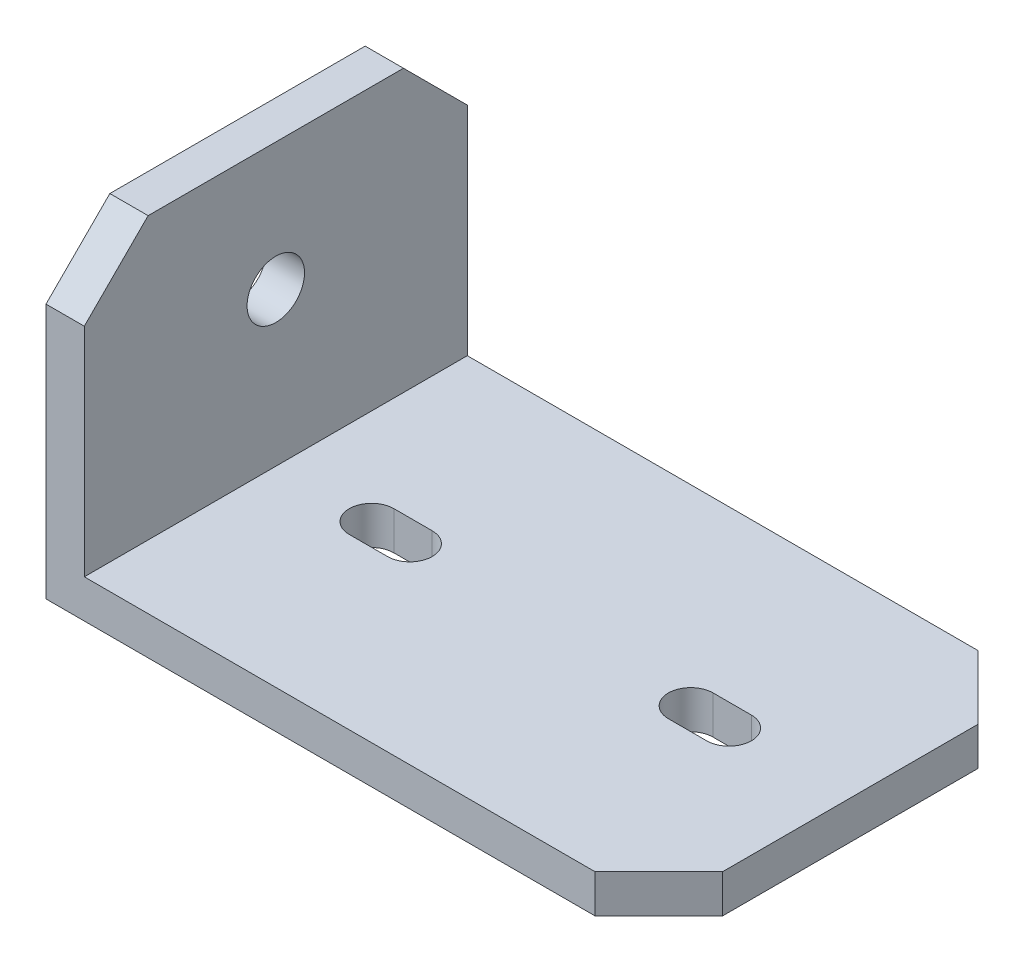
ISO-10303-21;
HEADER;
FILE_DESCRIPTION(('STEP AP214'),'2;1');
FILE_NAME('part.step','',(''),(''),'','','');
FILE_SCHEMA(('AUTOMOTIVE_DESIGN { 1 0 10303 214 1 1 1 1 }'));
ENDSEC;
DATA;
#1=APPLICATION_CONTEXT('core data for automotive mechanical design processes');
#2=APPLICATION_PROTOCOL_DEFINITION('international standard','automotive_design',2000,#1);
#3=PRODUCT_CONTEXT('',#1,'mechanical');
#4=PRODUCT('Part','Part','',(#3));
#5=PRODUCT_RELATED_PRODUCT_CATEGORY('part','',(#4));
#6=PRODUCT_DEFINITION_FORMATION('','',#4);
#7=PRODUCT_DEFINITION_CONTEXT('part definition',#1,'design');
#8=PRODUCT_DEFINITION('design','',#6,#7);
#9=PRODUCT_DEFINITION_SHAPE('','',#8);
#10=(LENGTH_UNIT() NAMED_UNIT(*) SI_UNIT(.MILLI.,.METRE.));
#11=(NAMED_UNIT(*) PLANE_ANGLE_UNIT() SI_UNIT($,.RADIAN.));
#12=(NAMED_UNIT(*) SI_UNIT($,.STERADIAN.) SOLID_ANGLE_UNIT());
#13=UNCERTAINTY_MEASURE_WITH_UNIT(LENGTH_MEASURE(1.E-05),#10,'distance_accuracy_value','');
#14=(GEOMETRIC_REPRESENTATION_CONTEXT(3) GLOBAL_UNCERTAINTY_ASSIGNED_CONTEXT((#13)) GLOBAL_UNIT_ASSIGNED_CONTEXT((#10,
#11,#12)) REPRESENTATION_CONTEXT('',''));
#15=CARTESIAN_POINT('',(0.,0.,0.));
#16=DIRECTION('',(0.,0.,1.));
#17=DIRECTION('',(1.,0.,0.));
#18=AXIS2_PLACEMENT_3D('',#15,#16,#17);
#19=CARTESIAN_POINT('',(-3.,22.,30.));
#20=DIRECTION('',(0.,-1.,0.));
#21=DIRECTION('',(0.,0.,-1.));
#22=AXIS2_PLACEMENT_3D('',#19,#20,#21);
#23=PLANE('',#22);
#24=DIRECTION('',(0.,0.,-1.));
#25=VECTOR('',#24,1.);
#26=CARTESIAN_POINT('',(-3.,22.,30.));
#27=LINE('',#26,#25);
#28=CARTESIAN_POINT('',(-3.,22.,25.));
#29=VERTEX_POINT('',#28);
#30=CARTESIAN_POINT('',(-3.,22.,5.));
#31=VERTEX_POINT('',#30);
#32=EDGE_CURVE('E273',#29,#31,#27,.T.);
#33=ORIENTED_EDGE('',*,*,#32,.F.);
#34=DIRECTION('',(1.,0.,0.));
#35=VECTOR('',#34,1.);
#36=CARTESIAN_POINT('',(-3.,22.,25.));
#37=LINE('',#36,#35);
#38=CARTESIAN_POINT('',(0.,22.,25.));
#39=VERTEX_POINT('',#38);
#40=EDGE_CURVE('E289',#29,#39,#37,.T.);
#41=ORIENTED_EDGE('',*,*,#40,.T.);
#42=DIRECTION('',(0.,0.,-1.));
#43=VECTOR('',#42,1.);
#44=CARTESIAN_POINT('',(0.,22.,30.));
#45=LINE('',#44,#43);
#46=CARTESIAN_POINT('',(0.,22.,5.));
#47=VERTEX_POINT('',#46);
#48=EDGE_CURVE('E252',#39,#47,#45,.T.);
#49=ORIENTED_EDGE('',*,*,#48,.T.);
#50=DIRECTION('',(-1.,0.,0.));
#51=VECTOR('',#50,1.);
#52=CARTESIAN_POINT('',(-3.,22.,5.));
#53=LINE('',#52,#51);
#54=EDGE_CURVE('E286',#47,#31,#53,.T.);
#55=ORIENTED_EDGE('',*,*,#54,.T.);
#56=EDGE_LOOP('',(#33,#41,#49,#55));
#57=FACE_BOUND('',#56,.T.);
#58=ADVANCED_FACE('F33',(#57),#23,.F.);
#59=CARTESIAN_POINT('',(-3.,-3.,30.));
#60=DIRECTION('',(1.,0.,0.));
#61=DIRECTION('',(0.,0.,-1.));
#62=AXIS2_PLACEMENT_3D('',#59,#60,#61);
#63=PLANE('',#62);
#64=CARTESIAN_POINT('',(-3.,12.,15.));
#65=DIRECTION('',(1.,0.,0.));
#66=DIRECTION('',(0.,0.,-1.));
#67=AXIS2_PLACEMENT_3D('',#64,#65,#66);
#68=CIRCLE('',#67,2.25);
#69=CARTESIAN_POINT('',(-3.,12.,12.75));
#70=VERTEX_POINT('',#69);
#71=EDGE_CURVE('E237',#70,#70,#68,.T.);
#72=ORIENTED_EDGE('',*,*,#71,.T.);
#73=EDGE_LOOP('',(#72));
#74=FACE_BOUND('',#73,.T.);
#75=DIRECTION('',(0.,-1.,0.));
#76=VECTOR('',#75,1.);
#77=CARTESIAN_POINT('',(-3.,-3.,30.));
#78=LINE('',#77,#76);
#79=CARTESIAN_POINT('',(-3.,17.,30.));
#80=VERTEX_POINT('',#79);
#81=CARTESIAN_POINT('',(-3.,-3.,30.));
#82=VERTEX_POINT('',#81);
#83=EDGE_CURVE('E241',#80,#82,#78,.T.);
#84=ORIENTED_EDGE('',*,*,#83,.F.);
#85=DIRECTION('',(0.,-0.707106781186546,0.707106781186549));
#86=VECTOR('',#85,1.);
#87=CARTESIAN_POINT('',(-3.,17.,30.));
#88=LINE('',#87,#86);
#89=EDGE_CURVE('E284',#80,#29,#88,.F.);
#90=ORIENTED_EDGE('',*,*,#89,.T.);
#91=ORIENTED_EDGE('',*,*,#32,.T.);
#92=DIRECTION('',(0.,-0.707106781186549,-0.707106781186546));
#93=VECTOR('',#92,1.);
#94=CARTESIAN_POINT('',(-3.,22.,5.));
#95=LINE('',#94,#93);
#96=CARTESIAN_POINT('',(-3.,17.,0.));
#97=VERTEX_POINT('',#96);
#98=EDGE_CURVE('E282',#31,#97,#95,.T.);
#99=ORIENTED_EDGE('',*,*,#98,.T.);
#100=DIRECTION('',(0.,-1.,0.));
#101=VECTOR('',#100,1.);
#102=CARTESIAN_POINT('',(-3.,-3.,0.));
#103=LINE('',#102,#101);
#104=CARTESIAN_POINT('',(-3.,-3.,0.));
#105=VERTEX_POINT('',#104);
#106=EDGE_CURVE('E240',#97,#105,#103,.T.);
#107=ORIENTED_EDGE('',*,*,#106,.T.);
#108=DIRECTION('',(0.,0.,-1.));
#109=VECTOR('',#108,1.);
#110=CARTESIAN_POINT('',(-3.,-3.,30.));
#111=LINE('',#110,#109);
#112=EDGE_CURVE('E270',#82,#105,#111,.T.);
#113=ORIENTED_EDGE('',*,*,#112,.F.);
#114=EDGE_LOOP('',(#84,#90,#91,#99,#107,#113));
#115=FACE_BOUND('',#114,.T.);
#116=ADVANCED_FACE('F337',(#74,#115),#63,.F.);
#117=CARTESIAN_POINT('',(45.,-3.,30.));
#118=DIRECTION('',(0.,1.,0.));
#119=DIRECTION('',(-1.,0.,0.));
#120=AXIS2_PLACEMENT_3D('',#117,#118,#119);
#121=PLANE('',#120);
#122=DIRECTION('',(-1.,0.,0.));
#123=VECTOR('',#122,1.);
#124=CARTESIAN_POINT('',(45.,-3.,13.25));
#125=LINE('',#124,#123);
#126=CARTESIAN_POINT('',(35.5,-3.,13.25));
#127=VERTEX_POINT('',#126);
#128=CARTESIAN_POINT('',(32.5,-3.,13.25));
#129=VERTEX_POINT('',#128);
#130=EDGE_CURVE('E196',#127,#129,#125,.T.);
#131=ORIENTED_EDGE('',*,*,#130,.T.);
#132=CARTESIAN_POINT('',(32.5,-3.,15.));
#133=DIRECTION('',(0.,1.,0.));
#134=DIRECTION('',(-1.,0.,0.));
#135=AXIS2_PLACEMENT_3D('',#132,#133,#134);
#136=CIRCLE('',#135,1.75);
#137=CARTESIAN_POINT('',(32.5,-3.,16.75));
#138=VERTEX_POINT('',#137);
#139=EDGE_CURVE('E199',#129,#138,#136,.T.);
#140=ORIENTED_EDGE('',*,*,#139,.T.);
#141=DIRECTION('',(1.,0.,0.));
#142=VECTOR('',#141,1.);
#143=CARTESIAN_POINT('',(45.,-3.,16.75));
#144=LINE('',#143,#142);
#145=CARTESIAN_POINT('',(35.5,-3.,16.75));
#146=VERTEX_POINT('',#145);
#147=EDGE_CURVE('E191',#138,#146,#144,.T.);
#148=ORIENTED_EDGE('',*,*,#147,.T.);
#149=CARTESIAN_POINT('',(35.5,-3.,15.));
#150=DIRECTION('',(0.,1.,0.));
#151=DIRECTION('',(-1.,0.,0.));
#152=AXIS2_PLACEMENT_3D('',#149,#150,#151);
#153=CIRCLE('',#152,1.75);
#154=EDGE_CURVE('E166',#146,#127,#153,.T.);
#155=ORIENTED_EDGE('',*,*,#154,.T.);
#156=EDGE_LOOP('',(#131,#140,#148,#155));
#157=FACE_BOUND('',#156,.T.);
#158=DIRECTION('',(-1.,0.,0.));
#159=VECTOR('',#158,1.);
#160=CARTESIAN_POINT('',(45.,-3.,13.25));
#161=LINE('',#160,#159);
#162=CARTESIAN_POINT('',(10.5,-3.,13.25));
#163=VERTEX_POINT('',#162);
#164=CARTESIAN_POINT('',(7.5,-3.,13.25));
#165=VERTEX_POINT('',#164);
#166=EDGE_CURVE('E228',#163,#165,#161,.T.);
#167=ORIENTED_EDGE('',*,*,#166,.T.);
#168=CARTESIAN_POINT('',(7.5,-3.,15.));
#169=DIRECTION('',(0.,1.,0.));
#170=DIRECTION('',(-1.,0.,0.));
#171=AXIS2_PLACEMENT_3D('',#168,#169,#170);
#172=CIRCLE('',#171,1.75);
#173=CARTESIAN_POINT('',(7.5,-3.,16.75));
#174=VERTEX_POINT('',#173);
#175=EDGE_CURVE('E231',#165,#174,#172,.T.);
#176=ORIENTED_EDGE('',*,*,#175,.T.);
#177=DIRECTION('',(1.,0.,0.));
#178=VECTOR('',#177,1.);
#179=CARTESIAN_POINT('',(45.,-3.,16.75));
#180=LINE('',#179,#178);
#181=CARTESIAN_POINT('',(10.5,-3.,16.75));
#182=VERTEX_POINT('',#181);
#183=EDGE_CURVE('E216',#174,#182,#180,.T.);
#184=ORIENTED_EDGE('',*,*,#183,.T.);
#185=CARTESIAN_POINT('',(10.5,-3.,15.));
#186=DIRECTION('',(0.,1.,0.));
#187=DIRECTION('',(-1.,0.,0.));
#188=AXIS2_PLACEMENT_3D('',#185,#186,#187);
#189=CIRCLE('',#188,1.75);
#190=EDGE_CURVE('E225',#182,#163,#189,.T.);
#191=ORIENTED_EDGE('',*,*,#190,.T.);
#192=EDGE_LOOP('',(#167,#176,#184,#191));
#193=FACE_BOUND('',#192,.T.);
#194=DIRECTION('',(0.,0.,-1.));
#195=VECTOR('',#194,1.);
#196=CARTESIAN_POINT('',(45.,-3.,30.));
#197=LINE('',#196,#195);
#198=CARTESIAN_POINT('',(45.,-3.,25.));
#199=VERTEX_POINT('',#198);
#200=CARTESIAN_POINT('',(45.,-3.,5.));
#201=VERTEX_POINT('',#200);
#202=EDGE_CURVE('E268',#199,#201,#197,.T.);
#203=ORIENTED_EDGE('',*,*,#202,.F.);
#204=DIRECTION('',(0.707106781186545,0.,-0.70710678118655));
#205=VECTOR('',#204,1.);
#206=CARTESIAN_POINT('',(40.,-3.,30.));
#207=LINE('',#206,#205);
#208=CARTESIAN_POINT('',(40.,-3.,30.));
#209=VERTEX_POINT('',#208);
#210=EDGE_CURVE('E11',#199,#209,#207,.F.);
#211=ORIENTED_EDGE('',*,*,#210,.T.);
#212=DIRECTION('',(1.,0.,0.));
#213=VECTOR('',#212,1.);
#214=CARTESIAN_POINT('',(45.,-3.,30.));
#215=LINE('',#214,#213);
#216=EDGE_CURVE('E243',#82,#209,#215,.T.);
#217=ORIENTED_EDGE('',*,*,#216,.F.);
#218=ORIENTED_EDGE('',*,*,#112,.T.);
#219=DIRECTION('',(1.,0.,0.));
#220=VECTOR('',#219,1.);
#221=CARTESIAN_POINT('',(45.,-3.,0.));
#222=LINE('',#221,#220);
#223=CARTESIAN_POINT('',(40.,-3.,0.));
#224=VERTEX_POINT('',#223);
#225=EDGE_CURVE('E254',#105,#224,#222,.T.);
#226=ORIENTED_EDGE('',*,*,#225,.T.);
#227=DIRECTION('',(0.707106781186549,0.,0.707106781186546));
#228=VECTOR('',#227,1.);
#229=CARTESIAN_POINT('',(45.,-3.,5.));
#230=LINE('',#229,#228);
#231=EDGE_CURVE('E41',#224,#201,#230,.T.);
#232=ORIENTED_EDGE('',*,*,#231,.T.);
#233=EDGE_LOOP('',(#203,#211,#217,#218,#226,#232));
#234=FACE_BOUND('',#233,.T.);
#235=ADVANCED_FACE('F322',(#157,#193,#234),#121,.F.);
#236=CARTESIAN_POINT('',(45.,0.,30.));
#237=DIRECTION('',(-1.,0.,0.));
#238=DIRECTION('',(0.,0.,1.));
#239=AXIS2_PLACEMENT_3D('',#236,#237,#238);
#240=PLANE('',#239);
#241=DIRECTION('',(0.,0.,-1.));
#242=VECTOR('',#241,1.);
#243=CARTESIAN_POINT('',(45.,0.,30.));
#244=LINE('',#243,#242);
#245=CARTESIAN_POINT('',(45.,0.,25.));
#246=VERTEX_POINT('',#245);
#247=CARTESIAN_POINT('',(45.,0.,5.));
#248=VERTEX_POINT('',#247);
#249=EDGE_CURVE('E265',#246,#248,#244,.T.);
#250=ORIENTED_EDGE('',*,*,#249,.F.);
#251=DIRECTION('',(0.,-1.,0.));
#252=VECTOR('',#251,1.);
#253=CARTESIAN_POINT('',(45.,0.,25.));
#254=LINE('',#253,#252);
#255=EDGE_CURVE('E54',#246,#199,#254,.T.);
#256=ORIENTED_EDGE('',*,*,#255,.T.);
#257=ORIENTED_EDGE('',*,*,#202,.T.);
#258=DIRECTION('',(0.,1.,0.));
#259=VECTOR('',#258,1.);
#260=CARTESIAN_POINT('',(45.,0.,5.));
#261=LINE('',#260,#259);
#262=EDGE_CURVE('E303',#201,#248,#261,.T.);
#263=ORIENTED_EDGE('',*,*,#262,.T.);
#264=EDGE_LOOP('',(#250,#256,#257,#263));
#265=FACE_BOUND('',#264,.T.);
#266=ADVANCED_FACE('F307',(#265),#240,.F.);
#267=CARTESIAN_POINT('',(0.,0.,30.));
#268=DIRECTION('',(0.,-1.,0.));
#269=DIRECTION('',(0.,0.,-1.));
#270=AXIS2_PLACEMENT_3D('',#267,#268,#269);
#271=PLANE('',#270);
#272=DIRECTION('',(1.,0.,0.));
#273=VECTOR('',#272,1.);
#274=CARTESIAN_POINT('',(32.5,0.,16.75));
#275=LINE('',#274,#273);
#276=CARTESIAN_POINT('',(32.5,0.,16.75));
#277=VERTEX_POINT('',#276);
#278=CARTESIAN_POINT('',(35.5,0.,16.75));
#279=VERTEX_POINT('',#278);
#280=EDGE_CURVE('E174',#277,#279,#275,.T.);
#281=ORIENTED_EDGE('',*,*,#280,.F.);
#282=CARTESIAN_POINT('',(32.5,0.,15.));
#283=DIRECTION('',(0.,1.,0.));
#284=DIRECTION('',(0.,0.,1.));
#285=AXIS2_PLACEMENT_3D('',#282,#283,#284);
#286=CIRCLE('',#285,1.75);
#287=CARTESIAN_POINT('',(32.5,0.,13.25));
#288=VERTEX_POINT('',#287);
#289=EDGE_CURVE('E179',#288,#277,#286,.T.);
#290=ORIENTED_EDGE('',*,*,#289,.F.);
#291=DIRECTION('',(-1.,0.,0.));
#292=VECTOR('',#291,1.);
#293=CARTESIAN_POINT('',(32.5,0.,13.25));
#294=LINE('',#293,#292);
#295=CARTESIAN_POINT('',(35.5,0.,13.25));
#296=VERTEX_POINT('',#295);
#297=EDGE_CURVE('E184',#296,#288,#294,.T.);
#298=ORIENTED_EDGE('',*,*,#297,.F.);
#299=CARTESIAN_POINT('',(35.5,0.,15.));
#300=DIRECTION('',(0.,1.,0.));
#301=DIRECTION('',(0.,0.,1.));
#302=AXIS2_PLACEMENT_3D('',#299,#300,#301);
#303=CIRCLE('',#302,1.75);
#304=EDGE_CURVE('E163',#279,#296,#303,.T.);
#305=ORIENTED_EDGE('',*,*,#304,.F.);
#306=EDGE_LOOP('',(#281,#290,#298,#305));
#307=FACE_BOUND('',#306,.T.);
#308=DIRECTION('',(1.,0.,0.));
#309=VECTOR('',#308,1.);
#310=CARTESIAN_POINT('',(7.5,0.,16.75));
#311=LINE('',#310,#309);
#312=CARTESIAN_POINT('',(7.5,0.,16.75));
#313=VERTEX_POINT('',#312);
#314=CARTESIAN_POINT('',(10.5,0.,16.75));
#315=VERTEX_POINT('',#314);
#316=EDGE_CURVE('E204',#313,#315,#311,.T.);
#317=ORIENTED_EDGE('',*,*,#316,.F.);
#318=CARTESIAN_POINT('',(7.5,0.,15.));
#319=DIRECTION('',(0.,1.,0.));
#320=DIRECTION('',(0.,0.,1.));
#321=AXIS2_PLACEMENT_3D('',#318,#319,#320);
#322=CIRCLE('',#321,1.75);
#323=CARTESIAN_POINT('',(7.5,0.,13.25));
#324=VERTEX_POINT('',#323);
#325=EDGE_CURVE('E202',#324,#313,#322,.T.);
#326=ORIENTED_EDGE('',*,*,#325,.F.);
#327=DIRECTION('',(-1.,0.,0.));
#328=VECTOR('',#327,1.);
#329=CARTESIAN_POINT('',(7.5,0.,13.25));
#330=LINE('',#329,#328);
#331=CARTESIAN_POINT('',(10.5,0.,13.25));
#332=VERTEX_POINT('',#331);
#333=EDGE_CURVE('E210',#332,#324,#330,.T.);
#334=ORIENTED_EDGE('',*,*,#333,.F.);
#335=CARTESIAN_POINT('',(10.5,0.,15.));
#336=DIRECTION('',(0.,1.,0.));
#337=DIRECTION('',(0.,0.,1.));
#338=AXIS2_PLACEMENT_3D('',#335,#336,#337);
#339=CIRCLE('',#338,1.75);
#340=EDGE_CURVE('E207',#315,#332,#339,.T.);
#341=ORIENTED_EDGE('',*,*,#340,.F.);
#342=EDGE_LOOP('',(#317,#326,#334,#341));
#343=FACE_BOUND('',#342,.T.);
#344=DIRECTION('',(-1.,0.,0.));
#345=VECTOR('',#344,1.);
#346=CARTESIAN_POINT('',(0.,0.,30.));
#347=LINE('',#346,#345);
#348=CARTESIAN_POINT('',(40.,0.,30.));
#349=VERTEX_POINT('',#348);
#350=CARTESIAN_POINT('',(0.,0.,30.));
#351=VERTEX_POINT('',#350);
#352=EDGE_CURVE('E247',#349,#351,#347,.T.);
#353=ORIENTED_EDGE('',*,*,#352,.F.);
#354=DIRECTION('',(-0.707106781186545,0.,0.70710678118655));
#355=VECTOR('',#354,1.);
#356=CARTESIAN_POINT('',(40.,0.,30.));
#357=LINE('',#356,#355);
#358=EDGE_CURVE('E301',#349,#246,#357,.F.);
#359=ORIENTED_EDGE('',*,*,#358,.T.);
#360=ORIENTED_EDGE('',*,*,#249,.T.);
#361=DIRECTION('',(-0.707106781186549,0.,-0.707106781186546));
#362=VECTOR('',#361,1.);
#363=CARTESIAN_POINT('',(45.,0.,5.));
#364=LINE('',#363,#362);
#365=CARTESIAN_POINT('',(40.,0.,0.));
#366=VERTEX_POINT('',#365);
#367=EDGE_CURVE('E299',#248,#366,#364,.T.);
#368=ORIENTED_EDGE('',*,*,#367,.T.);
#369=DIRECTION('',(-1.,0.,0.));
#370=VECTOR('',#369,1.);
#371=CARTESIAN_POINT('',(0.,0.,0.));
#372=LINE('',#371,#370);
#373=CARTESIAN_POINT('',(0.,0.,0.));
#374=VERTEX_POINT('',#373);
#375=EDGE_CURVE('E256',#366,#374,#372,.T.);
#376=ORIENTED_EDGE('',*,*,#375,.T.);
#377=DIRECTION('',(0.,0.,-1.));
#378=VECTOR('',#377,1.);
#379=CARTESIAN_POINT('',(0.,0.,30.));
#380=LINE('',#379,#378);
#381=EDGE_CURVE('E262',#351,#374,#380,.T.);
#382=ORIENTED_EDGE('',*,*,#381,.F.);
#383=EDGE_LOOP('',(#353,#359,#360,#368,#376,#382));
#384=FACE_BOUND('',#383,.T.);
#385=ADVANCED_FACE('F181',(#307,#343,#384),#271,.F.);
#386=CARTESIAN_POINT('',(0.,22.,30.));
#387=DIRECTION('',(-1.,0.,0.));
#388=DIRECTION('',(0.,-1.,0.));
#389=AXIS2_PLACEMENT_3D('',#386,#387,#388);
#390=PLANE('',#389);
#391=CARTESIAN_POINT('',(0.,12.,15.));
#392=DIRECTION('',(1.,0.,0.));
#393=DIRECTION('',(0.,1.,0.));
#394=AXIS2_PLACEMENT_3D('',#391,#392,#393);
#395=CIRCLE('',#394,2.25);
#396=CARTESIAN_POINT('',(0.,14.25,15.));
#397=VERTEX_POINT('',#396);
#398=EDGE_CURVE('E234',#397,#397,#395,.T.);
#399=ORIENTED_EDGE('',*,*,#398,.F.);
#400=EDGE_LOOP('',(#399));
#401=FACE_BOUND('',#400,.T.);
#402=ORIENTED_EDGE('',*,*,#48,.F.);
#403=DIRECTION('',(0.,0.707106781186546,-0.707106781186549));
#404=VECTOR('',#403,1.);
#405=CARTESIAN_POINT('',(0.,17.,30.));
#406=LINE('',#405,#404);
#407=CARTESIAN_POINT('',(0.,17.,30.));
#408=VERTEX_POINT('',#407);
#409=EDGE_CURVE('E293',#39,#408,#406,.F.);
#410=ORIENTED_EDGE('',*,*,#409,.T.);
#411=DIRECTION('',(0.,1.,0.));
#412=VECTOR('',#411,1.);
#413=CARTESIAN_POINT('',(0.,22.,30.));
#414=LINE('',#413,#412);
#415=EDGE_CURVE('E249',#351,#408,#414,.T.);
#416=ORIENTED_EDGE('',*,*,#415,.F.);
#417=ORIENTED_EDGE('',*,*,#381,.T.);
#418=DIRECTION('',(0.,1.,0.));
#419=VECTOR('',#418,1.);
#420=CARTESIAN_POINT('',(0.,22.,0.));
#421=LINE('',#420,#419);
#422=CARTESIAN_POINT('',(0.,17.,0.));
#423=VERTEX_POINT('',#422);
#424=EDGE_CURVE('E244',#374,#423,#421,.T.);
#425=ORIENTED_EDGE('',*,*,#424,.T.);
#426=DIRECTION('',(0.,0.707106781186549,0.707106781186546));
#427=VECTOR('',#426,1.);
#428=CARTESIAN_POINT('',(0.,22.,5.));
#429=LINE('',#428,#427);
#430=EDGE_CURVE('E291',#423,#47,#429,.T.);
#431=ORIENTED_EDGE('',*,*,#430,.T.);
#432=EDGE_LOOP('',(#402,#410,#416,#417,#425,#431));
#433=FACE_BOUND('',#432,.T.);
#434=ADVANCED_FACE('F360',(#401,#433),#390,.F.);
#435=CARTESIAN_POINT('',(0.,0.,30.));
#436=DIRECTION('',(0.,0.,-1.));
#437=DIRECTION('',(-1.,0.,0.));
#438=AXIS2_PLACEMENT_3D('',#435,#436,#437);
#439=PLANE('',#438);
#440=ORIENTED_EDGE('',*,*,#415,.T.);
#441=DIRECTION('',(-1.,0.,0.));
#442=VECTOR('',#441,1.);
#443=CARTESIAN_POINT('',(0.,17.,30.));
#444=LINE('',#443,#442);
#445=EDGE_CURVE('E279',#408,#80,#444,.T.);
#446=ORIENTED_EDGE('',*,*,#445,.T.);
#447=ORIENTED_EDGE('',*,*,#83,.T.);
#448=ORIENTED_EDGE('',*,*,#216,.T.);
#449=DIRECTION('',(0.,1.,0.));
#450=VECTOR('',#449,1.);
#451=CARTESIAN_POINT('',(40.,0.,30.));
#452=LINE('',#451,#450);
#453=EDGE_CURVE('E276',#209,#349,#452,.T.);
#454=ORIENTED_EDGE('',*,*,#453,.T.);
#455=ORIENTED_EDGE('',*,*,#352,.T.);
#456=EDGE_LOOP('',(#440,#446,#447,#448,#454,#455));
#457=FACE_BOUND('',#456,.T.);
#458=ADVANCED_FACE('F318',(#457),#439,.F.);
#459=CARTESIAN_POINT('',(0.,0.,0.));
#460=DIRECTION('',(0.,0.,-1.));
#461=DIRECTION('',(-1.,0.,0.));
#462=AXIS2_PLACEMENT_3D('',#459,#460,#461);
#463=PLANE('',#462);
#464=ORIENTED_EDGE('',*,*,#106,.F.);
#465=DIRECTION('',(1.,0.,0.));
#466=VECTOR('',#465,1.);
#467=CARTESIAN_POINT('',(0.,17.,0.));
#468=LINE('',#467,#466);
#469=EDGE_CURVE('E297',#97,#423,#468,.T.);
#470=ORIENTED_EDGE('',*,*,#469,.T.);
#471=ORIENTED_EDGE('',*,*,#424,.F.);
#472=ORIENTED_EDGE('',*,*,#375,.F.);
#473=DIRECTION('',(0.,-1.,0.));
#474=VECTOR('',#473,1.);
#475=CARTESIAN_POINT('',(40.,-3.,0.));
#476=LINE('',#475,#474);
#477=EDGE_CURVE('E295',#366,#224,#476,.T.);
#478=ORIENTED_EDGE('',*,*,#477,.T.);
#479=ORIENTED_EDGE('',*,*,#225,.F.);
#480=EDGE_LOOP('',(#464,#470,#471,#472,#478,#479));
#481=FACE_BOUND('',#480,.T.);
#482=ADVANCED_FACE('F327',(#481),#463,.T.);
#483=CARTESIAN_POINT('',(-30.,12.,15.));
#484=DIRECTION('',(1.,0.,0.));
#485=DIRECTION('',(0.,1.,0.));
#486=AXIS2_PLACEMENT_3D('',#483,#484,#485);
#487=CYLINDRICAL_SURFACE('',#486,2.25);
#488=ORIENTED_EDGE('',*,*,#398,.T.);
#489=EDGE_LOOP('',(#488));
#490=FACE_BOUND('',#489,.T.);
#491=ORIENTED_EDGE('',*,*,#71,.F.);
#492=EDGE_LOOP('',(#491));
#493=FACE_BOUND('',#492,.T.);
#494=ADVANCED_FACE('F414',(#490,#493),#487,.F.);
#495=CARTESIAN_POINT('',(7.5,-30.,15.));
#496=DIRECTION('',(0.,1.,0.));
#497=DIRECTION('',(0.,0.,1.));
#498=AXIS2_PLACEMENT_3D('',#495,#496,#497);
#499=CYLINDRICAL_SURFACE('',#498,1.75);
#500=DIRECTION('',(0.,1.,0.));
#501=VECTOR('',#500,1.);
#502=CARTESIAN_POINT('',(7.5,-30.,13.25));
#503=LINE('',#502,#501);
#504=EDGE_CURVE('E214',#165,#324,#503,.T.);
#505=ORIENTED_EDGE('',*,*,#504,.T.);
#506=ORIENTED_EDGE('',*,*,#325,.T.);
#507=DIRECTION('',(0.,1.,0.));
#508=VECTOR('',#507,1.);
#509=CARTESIAN_POINT('',(7.5,-30.,16.75));
#510=LINE('',#509,#508);
#511=EDGE_CURVE('E213',#174,#313,#510,.T.);
#512=ORIENTED_EDGE('',*,*,#511,.F.);
#513=ORIENTED_EDGE('',*,*,#175,.F.);
#514=EDGE_LOOP('',(#505,#506,#512,#513));
#515=FACE_BOUND('',#514,.T.);
#516=ADVANCED_FACE('F396',(#515),#499,.F.);
#517=CARTESIAN_POINT('',(7.5,-30.,13.25));
#518=DIRECTION('',(0.,0.,-1.));
#519=DIRECTION('',(-1.,0.,0.));
#520=AXIS2_PLACEMENT_3D('',#517,#518,#519);
#521=PLANE('',#520);
#522=DIRECTION('',(0.,1.,0.));
#523=VECTOR('',#522,1.);
#524=CARTESIAN_POINT('',(10.5,-30.,13.25));
#525=LINE('',#524,#523);
#526=EDGE_CURVE('E217',#163,#332,#525,.T.);
#527=ORIENTED_EDGE('',*,*,#526,.T.);
#528=ORIENTED_EDGE('',*,*,#333,.T.);
#529=ORIENTED_EDGE('',*,*,#504,.F.);
#530=ORIENTED_EDGE('',*,*,#166,.F.);
#531=EDGE_LOOP('',(#527,#528,#529,#530));
#532=FACE_BOUND('',#531,.T.);
#533=ADVANCED_FACE('F387',(#532),#521,.F.);
#534=CARTESIAN_POINT('',(10.5,-30.,15.));
#535=DIRECTION('',(0.,1.,0.));
#536=DIRECTION('',(0.,0.,1.));
#537=AXIS2_PLACEMENT_3D('',#534,#535,#536);
#538=CYLINDRICAL_SURFACE('',#537,1.75);
#539=DIRECTION('',(0.,1.,0.));
#540=VECTOR('',#539,1.);
#541=CARTESIAN_POINT('',(10.5,-30.,16.75));
#542=LINE('',#541,#540);
#543=EDGE_CURVE('E219',#182,#315,#542,.T.);
#544=ORIENTED_EDGE('',*,*,#543,.T.);
#545=ORIENTED_EDGE('',*,*,#340,.T.);
#546=ORIENTED_EDGE('',*,*,#526,.F.);
#547=ORIENTED_EDGE('',*,*,#190,.F.);
#548=EDGE_LOOP('',(#544,#545,#546,#547));
#549=FACE_BOUND('',#548,.T.);
#550=ADVANCED_FACE('F389',(#549),#538,.F.);
#551=CARTESIAN_POINT('',(7.5,-30.,16.75));
#552=DIRECTION('',(0.,0.,1.));
#553=DIRECTION('',(1.,0.,0.));
#554=AXIS2_PLACEMENT_3D('',#551,#552,#553);
#555=PLANE('',#554);
#556=ORIENTED_EDGE('',*,*,#511,.T.);
#557=ORIENTED_EDGE('',*,*,#316,.T.);
#558=ORIENTED_EDGE('',*,*,#543,.F.);
#559=ORIENTED_EDGE('',*,*,#183,.F.);
#560=EDGE_LOOP('',(#556,#557,#558,#559));
#561=FACE_BOUND('',#560,.T.);
#562=ADVANCED_FACE('F398',(#561),#555,.F.);
#563=CARTESIAN_POINT('',(32.5,-30.,15.));
#564=DIRECTION('',(0.,1.,0.));
#565=DIRECTION('',(0.,0.,1.));
#566=AXIS2_PLACEMENT_3D('',#563,#564,#565);
#567=CYLINDRICAL_SURFACE('',#566,1.75);
#568=DIRECTION('',(0.,1.,0.));
#569=VECTOR('',#568,1.);
#570=CARTESIAN_POINT('',(32.5,-30.,13.25));
#571=LINE('',#570,#569);
#572=EDGE_CURVE('E189',#129,#288,#571,.T.);
#573=ORIENTED_EDGE('',*,*,#572,.T.);
#574=ORIENTED_EDGE('',*,*,#289,.T.);
#575=DIRECTION('',(0.,1.,0.));
#576=VECTOR('',#575,1.);
#577=CARTESIAN_POINT('',(32.5,-30.,16.75));
#578=LINE('',#577,#576);
#579=EDGE_CURVE('E170',#138,#277,#578,.T.);
#580=ORIENTED_EDGE('',*,*,#579,.F.);
#581=ORIENTED_EDGE('',*,*,#139,.F.);
#582=EDGE_LOOP('',(#573,#574,#580,#581));
#583=FACE_BOUND('',#582,.T.);
#584=ADVANCED_FACE('F400',(#583),#567,.F.);
#585=CARTESIAN_POINT('',(32.5,-30.,13.25));
#586=DIRECTION('',(0.,0.,-1.));
#587=DIRECTION('',(-1.,0.,0.));
#588=AXIS2_PLACEMENT_3D('',#585,#586,#587);
#589=PLANE('',#588);
#590=DIRECTION('',(0.,1.,0.));
#591=VECTOR('',#590,1.);
#592=CARTESIAN_POINT('',(35.5,-30.,13.25));
#593=LINE('',#592,#591);
#594=EDGE_CURVE('E169',#127,#296,#593,.T.);
#595=ORIENTED_EDGE('',*,*,#594,.T.);
#596=ORIENTED_EDGE('',*,*,#297,.T.);
#597=ORIENTED_EDGE('',*,*,#572,.F.);
#598=ORIENTED_EDGE('',*,*,#130,.F.);
#599=EDGE_LOOP('',(#595,#596,#597,#598));
#600=FACE_BOUND('',#599,.T.);
#601=ADVANCED_FACE('F406',(#600),#589,.F.);
#602=CARTESIAN_POINT('',(35.5,-30.,15.));
#603=DIRECTION('',(0.,1.,0.));
#604=DIRECTION('',(0.,0.,1.));
#605=AXIS2_PLACEMENT_3D('',#602,#603,#604);
#606=CYLINDRICAL_SURFACE('',#605,1.75);
#607=DIRECTION('',(0.,1.,0.));
#608=VECTOR('',#607,1.);
#609=CARTESIAN_POINT('',(35.5,-30.,16.75));
#610=LINE('',#609,#608);
#611=EDGE_CURVE('E158',#146,#279,#610,.T.);
#612=ORIENTED_EDGE('',*,*,#611,.T.);
#613=ORIENTED_EDGE('',*,*,#304,.T.);
#614=ORIENTED_EDGE('',*,*,#594,.F.);
#615=ORIENTED_EDGE('',*,*,#154,.F.);
#616=EDGE_LOOP('',(#612,#613,#614,#615));
#617=FACE_BOUND('',#616,.T.);
#618=ADVANCED_FACE('F160',(#617),#606,.F.);
#619=CARTESIAN_POINT('',(32.5,-30.,16.75));
#620=DIRECTION('',(0.,0.,1.));
#621=DIRECTION('',(1.,0.,0.));
#622=AXIS2_PLACEMENT_3D('',#619,#620,#621);
#623=PLANE('',#622);
#624=ORIENTED_EDGE('',*,*,#579,.T.);
#625=ORIENTED_EDGE('',*,*,#280,.T.);
#626=ORIENTED_EDGE('',*,*,#611,.F.);
#627=ORIENTED_EDGE('',*,*,#147,.F.);
#628=EDGE_LOOP('',(#624,#625,#626,#627));
#629=FACE_BOUND('',#628,.T.);
#630=ADVANCED_FACE('F175',(#629),#623,.F.);
#631=CARTESIAN_POINT('',(0.,17.,30.));
#632=DIRECTION('',(0.,-0.707106781186549,-0.707106781186546));
#633=DIRECTION('',(-1.,0.,0.));
#634=AXIS2_PLACEMENT_3D('',#631,#632,#633);
#635=PLANE('',#634);
#636=ORIENTED_EDGE('',*,*,#409,.F.);
#637=ORIENTED_EDGE('',*,*,#40,.F.);
#638=ORIENTED_EDGE('',*,*,#89,.F.);
#639=ORIENTED_EDGE('',*,*,#445,.F.);
#640=EDGE_LOOP('',(#636,#637,#638,#639));
#641=FACE_BOUND('',#640,.T.);
#642=ADVANCED_FACE('F348',(#641),#635,.F.);
#643=CARTESIAN_POINT('',(-3.,22.,5.));
#644=DIRECTION('',(0.,0.707106781186546,-0.707106781186549));
#645=DIRECTION('',(1.,0.,0.));
#646=AXIS2_PLACEMENT_3D('',#643,#644,#645);
#647=PLANE('',#646);
#648=ORIENTED_EDGE('',*,*,#430,.F.);
#649=ORIENTED_EDGE('',*,*,#469,.F.);
#650=ORIENTED_EDGE('',*,*,#98,.F.);
#651=ORIENTED_EDGE('',*,*,#54,.F.);
#652=EDGE_LOOP('',(#648,#649,#650,#651));
#653=FACE_BOUND('',#652,.T.);
#654=ADVANCED_FACE('F335',(#653),#647,.T.);
#655=CARTESIAN_POINT('',(40.,0.,30.));
#656=DIRECTION('',(-0.70710678118655,0.,-0.707106781186545));
#657=DIRECTION('',(0.,1.,0.));
#658=AXIS2_PLACEMENT_3D('',#655,#656,#657);
#659=PLANE('',#658);
#660=ORIENTED_EDGE('',*,*,#210,.F.);
#661=ORIENTED_EDGE('',*,*,#255,.F.);
#662=ORIENTED_EDGE('',*,*,#358,.F.);
#663=ORIENTED_EDGE('',*,*,#453,.F.);
#664=EDGE_LOOP('',(#660,#661,#662,#663));
#665=FACE_BOUND('',#664,.T.);
#666=ADVANCED_FACE('F316',(#665),#659,.F.);
#667=CARTESIAN_POINT('',(45.,0.,5.));
#668=DIRECTION('',(0.707106781186546,0.,-0.707106781186549));
#669=DIRECTION('',(0.,-1.,0.));
#670=AXIS2_PLACEMENT_3D('',#667,#668,#669);
#671=PLANE('',#670);
#672=ORIENTED_EDGE('',*,*,#231,.F.);
#673=ORIENTED_EDGE('',*,*,#477,.F.);
#674=ORIENTED_EDGE('',*,*,#367,.F.);
#675=ORIENTED_EDGE('',*,*,#262,.F.);
#676=EDGE_LOOP('',(#672,#673,#674,#675));
#677=FACE_BOUND('',#676,.T.);
#678=ADVANCED_FACE('F35',(#677),#671,.T.);
#679=CLOSED_SHELL('',(#58,#116,#235,#266,#385,#434,#458,#482,#494,#516,#533,#550,#562,#584,#601,
#618,#630,#642,#654,#666,#678));
#680=MANIFOLD_SOLID_BREP('B2',#679);
#681=ADVANCED_BREP_SHAPE_REPRESENTATION('',(#18,#680),#14);
#682=SHAPE_DEFINITION_REPRESENTATION(#9,#681);
ENDSEC;
END-ISO-10303-21;
